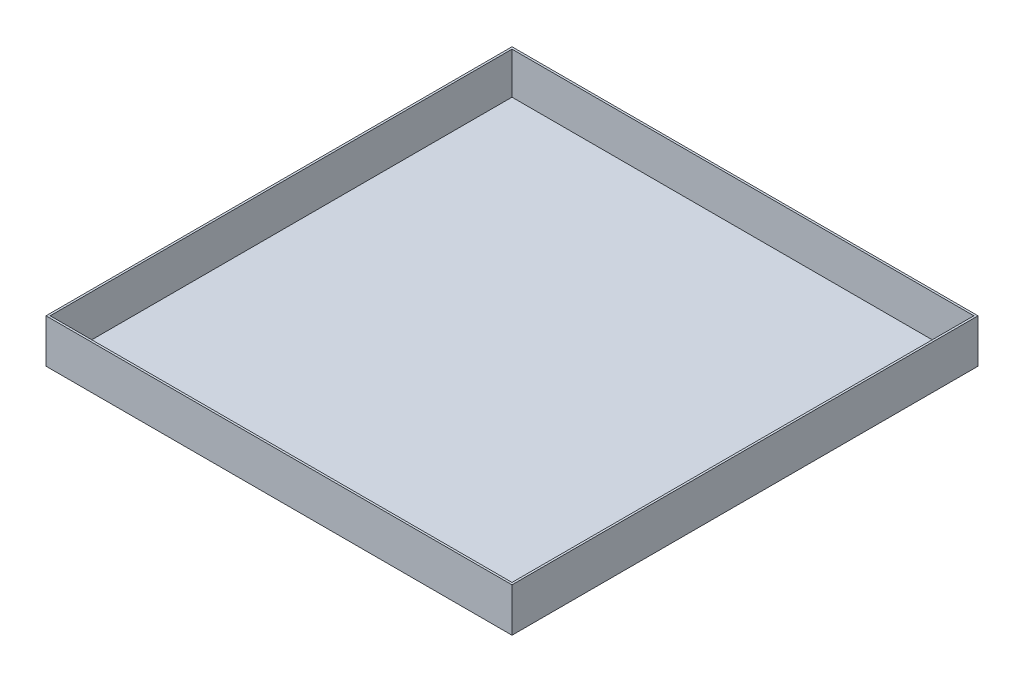
ISO-10303-21;
HEADER;
FILE_DESCRIPTION(('STEP AP214'),'2;1');
FILE_NAME('part.step','',(''),(''),'','','');
FILE_SCHEMA(('AUTOMOTIVE_DESIGN { 1 0 10303 214 1 1 1 1 }'));
ENDSEC;
DATA;
#1=APPLICATION_CONTEXT('core data for automotive mechanical design processes');
#2=APPLICATION_PROTOCOL_DEFINITION('international standard','automotive_design',2000,#1);
#3=PRODUCT_CONTEXT('',#1,'mechanical');
#4=PRODUCT('Part','Part','',(#3));
#5=PRODUCT_RELATED_PRODUCT_CATEGORY('part','',(#4));
#6=PRODUCT_DEFINITION_FORMATION('','',#4);
#7=PRODUCT_DEFINITION_CONTEXT('part definition',#1,'design');
#8=PRODUCT_DEFINITION('design','',#6,#7);
#9=PRODUCT_DEFINITION_SHAPE('','',#8);
#10=(LENGTH_UNIT() NAMED_UNIT(*) SI_UNIT(.MILLI.,.METRE.));
#11=(NAMED_UNIT(*) PLANE_ANGLE_UNIT() SI_UNIT($,.RADIAN.));
#12=(NAMED_UNIT(*) SI_UNIT($,.STERADIAN.) SOLID_ANGLE_UNIT());
#13=UNCERTAINTY_MEASURE_WITH_UNIT(LENGTH_MEASURE(1.E-05),#10,'distance_accuracy_value','');
#14=(GEOMETRIC_REPRESENTATION_CONTEXT(3) GLOBAL_UNCERTAINTY_ASSIGNED_CONTEXT((#13)) GLOBAL_UNIT_ASSIGNED_CONTEXT((#10,
#11,#12)) REPRESENTATION_CONTEXT('',''));
#15=CARTESIAN_POINT('',(0.,0.,0.));
#16=DIRECTION('',(0.,0.,1.));
#17=DIRECTION('',(1.,0.,0.));
#18=AXIS2_PLACEMENT_3D('',#15,#16,#17);
#19=CARTESIAN_POINT('',(112.,1.,-112.));
#20=DIRECTION('',(-1.,0.,0.));
#21=DIRECTION('',(0.,0.,1.));
#22=AXIS2_PLACEMENT_3D('',#19,#20,#21);
#23=PLANE('',#22);
#24=DIRECTION('',(0.,0.,-1.));
#25=VECTOR('',#24,1.);
#26=CARTESIAN_POINT('',(112.,0.,-112.));
#27=LINE('',#26,#25);
#28=CARTESIAN_POINT('',(112.,0.,112.));
#29=VERTEX_POINT('',#28);
#30=CARTESIAN_POINT('',(112.,0.,-112.));
#31=VERTEX_POINT('',#30);
#32=EDGE_CURVE('E111',#29,#31,#27,.T.);
#33=ORIENTED_EDGE('',*,*,#32,.T.);
#34=DIRECTION('',(0.,-1.,0.));
#35=VECTOR('',#34,1.);
#36=CARTESIAN_POINT('',(112.,1.,-112.));
#37=LINE('',#36,#35);
#38=CARTESIAN_POINT('',(112.,21.,-112.));
#39=VERTEX_POINT('',#38);
#40=EDGE_CURVE('E11',#39,#31,#37,.T.);
#41=ORIENTED_EDGE('',*,*,#40,.F.);
#42=DIRECTION('',(0.,0.,-1.));
#43=VECTOR('',#42,1.);
#44=CARTESIAN_POINT('',(112.,21.,0.));
#45=LINE('',#44,#43);
#46=CARTESIAN_POINT('',(112.,21.,112.));
#47=VERTEX_POINT('',#46);
#48=EDGE_CURVE('E133',#47,#39,#45,.T.);
#49=ORIENTED_EDGE('',*,*,#48,.F.);
#50=DIRECTION('',(0.,-1.,0.));
#51=VECTOR('',#50,1.);
#52=CARTESIAN_POINT('',(112.,1.,112.));
#53=LINE('',#52,#51);
#54=EDGE_CURVE('E159',#47,#29,#53,.T.);
#55=ORIENTED_EDGE('',*,*,#54,.T.);
#56=EDGE_LOOP('',(#33,#41,#49,#55));
#57=FACE_BOUND('',#56,.T.);
#58=ADVANCED_FACE('F34',(#57),#23,.F.);
#59=CARTESIAN_POINT('',(-112.,1.,-112.));
#60=DIRECTION('',(0.,0.,1.));
#61=DIRECTION('',(1.,0.,0.));
#62=AXIS2_PLACEMENT_3D('',#59,#60,#61);
#63=PLANE('',#62);
#64=DIRECTION('',(-1.,0.,0.));
#65=VECTOR('',#64,1.);
#66=CARTESIAN_POINT('',(-112.,0.,-112.));
#67=LINE('',#66,#65);
#68=CARTESIAN_POINT('',(-112.,0.,-112.));
#69=VERTEX_POINT('',#68);
#70=EDGE_CURVE('E154',#31,#69,#67,.T.);
#71=ORIENTED_EDGE('',*,*,#70,.T.);
#72=DIRECTION('',(0.,-1.,0.));
#73=VECTOR('',#72,1.);
#74=CARTESIAN_POINT('',(-112.,1.,-112.));
#75=LINE('',#74,#73);
#76=CARTESIAN_POINT('',(-112.,21.,-112.));
#77=VERTEX_POINT('',#76);
#78=EDGE_CURVE('E41',#77,#69,#75,.T.);
#79=ORIENTED_EDGE('',*,*,#78,.F.);
#80=DIRECTION('',(-1.,0.,0.));
#81=VECTOR('',#80,1.);
#82=CARTESIAN_POINT('',(0.,21.,-112.));
#83=LINE('',#82,#81);
#84=EDGE_CURVE('E136',#39,#77,#83,.T.);
#85=ORIENTED_EDGE('',*,*,#84,.F.);
#86=ORIENTED_EDGE('',*,*,#40,.T.);
#87=EDGE_LOOP('',(#71,#79,#85,#86));
#88=FACE_BOUND('',#87,.T.);
#89=ADVANCED_FACE('F176',(#88),#63,.F.);
#90=CARTESIAN_POINT('',(-112.,1.,-112.));
#91=DIRECTION('',(1.,0.,0.));
#92=DIRECTION('',(0.,0.,-1.));
#93=AXIS2_PLACEMENT_3D('',#90,#91,#92);
#94=PLANE('',#93);
#95=DIRECTION('',(0.,0.,1.));
#96=VECTOR('',#95,1.);
#97=CARTESIAN_POINT('',(-112.,0.,-112.));
#98=LINE('',#97,#96);
#99=CARTESIAN_POINT('',(-112.,0.,112.));
#100=VERTEX_POINT('',#99);
#101=EDGE_CURVE('E156',#69,#100,#98,.T.);
#102=ORIENTED_EDGE('',*,*,#101,.T.);
#103=DIRECTION('',(0.,-1.,0.));
#104=VECTOR('',#103,1.);
#105=CARTESIAN_POINT('',(-112.,1.,112.));
#106=LINE('',#105,#104);
#107=CARTESIAN_POINT('',(-112.,21.,112.));
#108=VERTEX_POINT('',#107);
#109=EDGE_CURVE('E161',#108,#100,#106,.T.);
#110=ORIENTED_EDGE('',*,*,#109,.F.);
#111=DIRECTION('',(0.,0.,1.));
#112=VECTOR('',#111,1.);
#113=CARTESIAN_POINT('',(-112.,21.,0.));
#114=LINE('',#113,#112);
#115=EDGE_CURVE('E139',#77,#108,#114,.T.);
#116=ORIENTED_EDGE('',*,*,#115,.F.);
#117=ORIENTED_EDGE('',*,*,#78,.T.);
#118=EDGE_LOOP('',(#102,#110,#116,#117));
#119=FACE_BOUND('',#118,.T.);
#120=ADVANCED_FACE('F166',(#119),#94,.F.);
#121=CARTESIAN_POINT('',(-112.,1.,112.));
#122=DIRECTION('',(0.,0.,-1.));
#123=DIRECTION('',(-1.,0.,0.));
#124=AXIS2_PLACEMENT_3D('',#121,#122,#123);
#125=PLANE('',#124);
#126=DIRECTION('',(1.,0.,0.));
#127=VECTOR('',#126,1.);
#128=CARTESIAN_POINT('',(-112.,0.,112.));
#129=LINE('',#128,#127);
#130=EDGE_CURVE('E56',#100,#29,#129,.T.);
#131=ORIENTED_EDGE('',*,*,#130,.T.);
#132=ORIENTED_EDGE('',*,*,#54,.F.);
#133=DIRECTION('',(1.,0.,0.));
#134=VECTOR('',#133,1.);
#135=CARTESIAN_POINT('',(0.,21.,112.));
#136=LINE('',#135,#134);
#137=EDGE_CURVE('E130',#108,#47,#136,.T.);
#138=ORIENTED_EDGE('',*,*,#137,.F.);
#139=ORIENTED_EDGE('',*,*,#109,.T.);
#140=EDGE_LOOP('',(#131,#132,#138,#139));
#141=FACE_BOUND('',#140,.T.);
#142=ADVANCED_FACE('F175',(#141),#125,.F.);
#143=CARTESIAN_POINT('',(0.,0.,0.));
#144=DIRECTION('',(0.,1.,0.));
#145=DIRECTION('',(0.,0.,1.));
#146=AXIS2_PLACEMENT_3D('',#143,#144,#145);
#147=PLANE('',#146);
#148=ORIENTED_EDGE('',*,*,#32,.F.);
#149=ORIENTED_EDGE('',*,*,#130,.F.);
#150=ORIENTED_EDGE('',*,*,#101,.F.);
#151=ORIENTED_EDGE('',*,*,#70,.F.);
#152=EDGE_LOOP('',(#148,#149,#150,#151));
#153=FACE_BOUND('',#152,.T.);
#154=ADVANCED_FACE('F171',(#153),#147,.F.);
#155=CARTESIAN_POINT('',(-111.,21.,0.));
#156=DIRECTION('',(1.,0.,0.));
#157=DIRECTION('',(0.,0.,-1.));
#158=AXIS2_PLACEMENT_3D('',#155,#156,#157);
#159=PLANE('',#158);
#160=DIRECTION('',(0.,0.,1.));
#161=VECTOR('',#160,1.);
#162=CARTESIAN_POINT('',(-111.,1.,0.));
#163=LINE('',#162,#161);
#164=CARTESIAN_POINT('',(-111.,1.,-111.));
#165=VERTEX_POINT('',#164);
#166=CARTESIAN_POINT('',(-111.,1.,111.));
#167=VERTEX_POINT('',#166);
#168=EDGE_CURVE('E106',#165,#167,#163,.T.);
#169=ORIENTED_EDGE('',*,*,#168,.F.);
#170=DIRECTION('',(0.,-1.,0.));
#171=VECTOR('',#170,1.);
#172=CARTESIAN_POINT('',(-111.,21.,-111.));
#173=LINE('',#172,#171);
#174=CARTESIAN_POINT('',(-111.,21.,-111.));
#175=VERTEX_POINT('',#174);
#176=EDGE_CURVE('E101',#175,#165,#173,.T.);
#177=ORIENTED_EDGE('',*,*,#176,.F.);
#178=DIRECTION('',(0.,0.,1.));
#179=VECTOR('',#178,1.);
#180=CARTESIAN_POINT('',(-111.,21.,0.));
#181=LINE('',#180,#179);
#182=CARTESIAN_POINT('',(-111.,21.,111.));
#183=VERTEX_POINT('',#182);
#184=EDGE_CURVE('E104',#175,#183,#181,.T.);
#185=ORIENTED_EDGE('',*,*,#184,.T.);
#186=DIRECTION('',(0.,-1.,0.));
#187=VECTOR('',#186,1.);
#188=CARTESIAN_POINT('',(-111.,21.,111.));
#189=LINE('',#188,#187);
#190=EDGE_CURVE('E142',#183,#167,#189,.T.);
#191=ORIENTED_EDGE('',*,*,#190,.T.);
#192=EDGE_LOOP('',(#169,#177,#185,#191));
#193=FACE_BOUND('',#192,.T.);
#194=ADVANCED_FACE('F103',(#193),#159,.T.);
#195=CARTESIAN_POINT('',(0.,21.,-111.));
#196=DIRECTION('',(0.,0.,1.));
#197=DIRECTION('',(1.,0.,0.));
#198=AXIS2_PLACEMENT_3D('',#195,#196,#197);
#199=PLANE('',#198);
#200=DIRECTION('',(-1.,0.,0.));
#201=VECTOR('',#200,1.);
#202=CARTESIAN_POINT('',(0.,1.,-111.));
#203=LINE('',#202,#201);
#204=CARTESIAN_POINT('',(111.,1.,-111.));
#205=VERTEX_POINT('',#204);
#206=EDGE_CURVE('E144',#205,#165,#203,.T.);
#207=ORIENTED_EDGE('',*,*,#206,.F.);
#208=DIRECTION('',(0.,-1.,0.));
#209=VECTOR('',#208,1.);
#210=CARTESIAN_POINT('',(111.,21.,-111.));
#211=LINE('',#210,#209);
#212=CARTESIAN_POINT('',(111.,21.,-111.));
#213=VERTEX_POINT('',#212);
#214=EDGE_CURVE('E112',#213,#205,#211,.T.);
#215=ORIENTED_EDGE('',*,*,#214,.F.);
#216=DIRECTION('',(-1.,0.,0.));
#217=VECTOR('',#216,1.);
#218=CARTESIAN_POINT('',(0.,21.,-111.));
#219=LINE('',#218,#217);
#220=EDGE_CURVE('E118',#213,#175,#219,.T.);
#221=ORIENTED_EDGE('',*,*,#220,.T.);
#222=ORIENTED_EDGE('',*,*,#176,.T.);
#223=EDGE_LOOP('',(#207,#215,#221,#222));
#224=FACE_BOUND('',#223,.T.);
#225=ADVANCED_FACE('F123',(#224),#199,.T.);
#226=CARTESIAN_POINT('',(111.,21.,0.));
#227=DIRECTION('',(1.,0.,0.));
#228=DIRECTION('',(0.,0.,-1.));
#229=AXIS2_PLACEMENT_3D('',#226,#227,#228);
#230=PLANE('',#229);
#231=DIRECTION('',(0.,0.,1.));
#232=VECTOR('',#231,1.);
#233=CARTESIAN_POINT('',(111.,1.,0.));
#234=LINE('',#233,#232);
#235=CARTESIAN_POINT('',(111.,1.,111.));
#236=VERTEX_POINT('',#235);
#237=EDGE_CURVE('E146',#205,#236,#234,.T.);
#238=ORIENTED_EDGE('',*,*,#237,.T.);
#239=DIRECTION('',(0.,-1.,0.));
#240=VECTOR('',#239,1.);
#241=CARTESIAN_POINT('',(111.,21.,111.));
#242=LINE('',#241,#240);
#243=CARTESIAN_POINT('',(111.,21.,111.));
#244=VERTEX_POINT('',#243);
#245=EDGE_CURVE('E48',#244,#236,#242,.T.);
#246=ORIENTED_EDGE('',*,*,#245,.F.);
#247=DIRECTION('',(0.,0.,1.));
#248=VECTOR('',#247,1.);
#249=CARTESIAN_POINT('',(111.,21.,0.));
#250=LINE('',#249,#248);
#251=EDGE_CURVE('E125',#213,#244,#250,.T.);
#252=ORIENTED_EDGE('',*,*,#251,.F.);
#253=ORIENTED_EDGE('',*,*,#214,.T.);
#254=EDGE_LOOP('',(#238,#246,#252,#253));
#255=FACE_BOUND('',#254,.T.);
#256=ADVANCED_FACE('F196',(#255),#230,.F.);
#257=CARTESIAN_POINT('',(0.,21.,111.));
#258=DIRECTION('',(0.,0.,1.));
#259=DIRECTION('',(1.,0.,0.));
#260=AXIS2_PLACEMENT_3D('',#257,#258,#259);
#261=PLANE('',#260);
#262=DIRECTION('',(-1.,0.,0.));
#263=VECTOR('',#262,1.);
#264=CARTESIAN_POINT('',(0.,1.,111.));
#265=LINE('',#264,#263);
#266=EDGE_CURVE('E121',#236,#167,#265,.T.);
#267=ORIENTED_EDGE('',*,*,#266,.T.);
#268=ORIENTED_EDGE('',*,*,#190,.F.);
#269=DIRECTION('',(-1.,0.,0.));
#270=VECTOR('',#269,1.);
#271=CARTESIAN_POINT('',(0.,21.,111.));
#272=LINE('',#271,#270);
#273=EDGE_CURVE('E119',#244,#183,#272,.T.);
#274=ORIENTED_EDGE('',*,*,#273,.F.);
#275=ORIENTED_EDGE('',*,*,#245,.T.);
#276=EDGE_LOOP('',(#267,#268,#274,#275));
#277=FACE_BOUND('',#276,.T.);
#278=ADVANCED_FACE('F199',(#277),#261,.F.);
#279=CARTESIAN_POINT('',(0.,21.,0.));
#280=DIRECTION('',(0.,1.,0.));
#281=DIRECTION('',(0.,0.,1.));
#282=AXIS2_PLACEMENT_3D('',#279,#280,#281);
#283=PLANE('',#282);
#284=ORIENTED_EDGE('',*,*,#184,.F.);
#285=ORIENTED_EDGE('',*,*,#220,.F.);
#286=ORIENTED_EDGE('',*,*,#251,.T.);
#287=ORIENTED_EDGE('',*,*,#273,.T.);
#288=EDGE_LOOP('',(#284,#285,#286,#287));
#289=FACE_BOUND('',#288,.T.);
#290=ORIENTED_EDGE('',*,*,#137,.T.);
#291=ORIENTED_EDGE('',*,*,#48,.T.);
#292=ORIENTED_EDGE('',*,*,#84,.T.);
#293=ORIENTED_EDGE('',*,*,#115,.T.);
#294=EDGE_LOOP('',(#290,#291,#292,#293));
#295=FACE_BOUND('',#294,.T.);
#296=ADVANCED_FACE('F116',(#289,#295),#283,.T.);
#297=CARTESIAN_POINT('',(0.,1.,0.));
#298=DIRECTION('',(0.,1.,0.));
#299=DIRECTION('',(0.,0.,1.));
#300=AXIS2_PLACEMENT_3D('',#297,#298,#299);
#301=PLANE('',#300);
#302=ORIENTED_EDGE('',*,*,#168,.T.);
#303=ORIENTED_EDGE('',*,*,#266,.F.);
#304=ORIENTED_EDGE('',*,*,#237,.F.);
#305=ORIENTED_EDGE('',*,*,#206,.T.);
#306=EDGE_LOOP('',(#302,#303,#304,#305));
#307=FACE_BOUND('',#306,.T.);
#308=ADVANCED_FACE('F188',(#307),#301,.T.);
#309=CLOSED_SHELL('',(#58,#89,#120,#142,#154,#194,#225,#256,#278,#296,#308));
#310=MANIFOLD_SOLID_BREP('B2',#309);
#311=ADVANCED_BREP_SHAPE_REPRESENTATION('',(#18,#310),#14);
#312=SHAPE_DEFINITION_REPRESENTATION(#9,#311);
ENDSEC;
END-ISO-10303-21;
